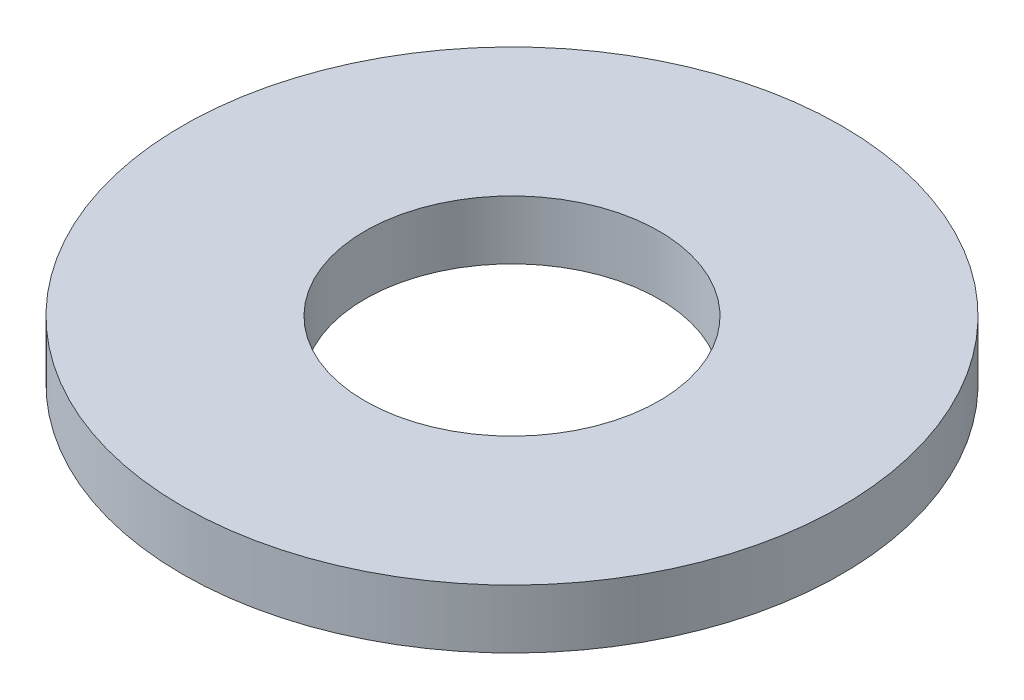
ISO-10303-21;
HEADER;
FILE_DESCRIPTION(('STEP AP214'),'2;1');
FILE_NAME('part.step','',(''),(''),'','','');
FILE_SCHEMA(('AUTOMOTIVE_DESIGN { 1 0 10303 214 1 1 1 1 }'));
ENDSEC;
DATA;
#1=APPLICATION_CONTEXT('core data for automotive mechanical design processes');
#2=APPLICATION_PROTOCOL_DEFINITION('international standard','automotive_design',2000,#1);
#3=PRODUCT_CONTEXT('',#1,'mechanical');
#4=PRODUCT('Part','Part','',(#3));
#5=PRODUCT_RELATED_PRODUCT_CATEGORY('part','',(#4));
#6=PRODUCT_DEFINITION_FORMATION('','',#4);
#7=PRODUCT_DEFINITION_CONTEXT('part definition',#1,'design');
#8=PRODUCT_DEFINITION('design','',#6,#7);
#9=PRODUCT_DEFINITION_SHAPE('','',#8);
#10=(LENGTH_UNIT() NAMED_UNIT(*) SI_UNIT(.MILLI.,.METRE.));
#11=(NAMED_UNIT(*) PLANE_ANGLE_UNIT() SI_UNIT($,.RADIAN.));
#12=(NAMED_UNIT(*) SI_UNIT($,.STERADIAN.) SOLID_ANGLE_UNIT());
#13=UNCERTAINTY_MEASURE_WITH_UNIT(LENGTH_MEASURE(1.E-05),#10,'distance_accuracy_value','');
#14=(GEOMETRIC_REPRESENTATION_CONTEXT(3) GLOBAL_UNCERTAINTY_ASSIGNED_CONTEXT((#13)) GLOBAL_UNIT_ASSIGNED_CONTEXT((#10,
#11,#12)) REPRESENTATION_CONTEXT('',''));
#15=CARTESIAN_POINT('',(0.,0.,0.));
#16=DIRECTION('',(0.,0.,1.));
#17=DIRECTION('',(1.,0.,0.));
#18=AXIS2_PLACEMENT_3D('',#15,#16,#17);
#19=CARTESIAN_POINT('',(0.,3.175,0.));
#20=DIRECTION('',(0.,1.,0.));
#21=DIRECTION('',(0.,0.,1.));
#22=AXIS2_PLACEMENT_3D('',#19,#20,#21);
#23=PLANE('',#22);
#24=CARTESIAN_POINT('',(0.,3.175,0.));
#25=DIRECTION('',(0.,1.,0.));
#26=DIRECTION('',(0.,0.,1.));
#27=AXIS2_PLACEMENT_3D('',#24,#25,#26);
#28=CIRCLE('',#27,17.78);
#29=CARTESIAN_POINT('',(0.,3.175,17.78));
#30=VERTEX_POINT('',#29);
#31=EDGE_CURVE('E10',#30,#30,#28,.T.);
#32=ORIENTED_EDGE('',*,*,#31,.T.);
#33=EDGE_LOOP('',(#32));
#34=FACE_BOUND('',#33,.T.);
#35=CARTESIAN_POINT('',(0.,3.175,0.));
#36=DIRECTION('',(0.,1.,0.));
#37=DIRECTION('',(0.,0.,1.));
#38=AXIS2_PLACEMENT_3D('',#35,#36,#37);
#39=CIRCLE('',#38,7.9375);
#40=CARTESIAN_POINT('',(0.,3.175,7.9375));
#41=VERTEX_POINT('',#40);
#42=EDGE_CURVE('E49',#41,#41,#39,.T.);
#43=ORIENTED_EDGE('',*,*,#42,.F.);
#44=EDGE_LOOP('',(#43));
#45=FACE_BOUND('',#44,.T.);
#46=ADVANCED_FACE('F38',(#34,#45),#23,.T.);
#47=CARTESIAN_POINT('',(0.,0.,0.));
#48=DIRECTION('',(0.,1.,0.));
#49=DIRECTION('',(0.,0.,1.));
#50=AXIS2_PLACEMENT_3D('',#47,#48,#49);
#51=PLANE('',#50);
#52=CARTESIAN_POINT('',(0.,0.,0.));
#53=DIRECTION('',(0.,1.,0.));
#54=DIRECTION('',(0.,0.,1.));
#55=AXIS2_PLACEMENT_3D('',#52,#53,#54);
#56=CIRCLE('',#55,17.78);
#57=CARTESIAN_POINT('',(0.,0.,17.78));
#58=VERTEX_POINT('',#57);
#59=EDGE_CURVE('E42',#58,#58,#56,.T.);
#60=ORIENTED_EDGE('',*,*,#59,.F.);
#61=EDGE_LOOP('',(#60));
#62=FACE_BOUND('',#61,.T.);
#63=CARTESIAN_POINT('',(0.,0.,0.));
#64=DIRECTION('',(0.,1.,0.));
#65=DIRECTION('',(0.,0.,1.));
#66=AXIS2_PLACEMENT_3D('',#63,#64,#65);
#67=CIRCLE('',#66,7.9375);
#68=CARTESIAN_POINT('',(0.,0.,7.9375));
#69=VERTEX_POINT('',#68);
#70=EDGE_CURVE('E51',#69,#69,#67,.T.);
#71=ORIENTED_EDGE('',*,*,#70,.T.);
#72=EDGE_LOOP('',(#71));
#73=FACE_BOUND('',#72,.T.);
#74=ADVANCED_FACE('F61',(#62,#73),#51,.F.);
#75=CARTESIAN_POINT('',(0.,3.175,0.));
#76=DIRECTION('',(0.,-1.,0.));
#77=DIRECTION('',(0.,0.,-1.));
#78=AXIS2_PLACEMENT_3D('',#75,#76,#77);
#79=CYLINDRICAL_SURFACE('',#78,17.78);
#80=ORIENTED_EDGE('',*,*,#31,.F.);
#81=EDGE_LOOP('',(#80));
#82=FACE_BOUND('',#81,.T.);
#83=ORIENTED_EDGE('',*,*,#59,.T.);
#84=EDGE_LOOP('',(#83));
#85=FACE_BOUND('',#84,.T.);
#86=ADVANCED_FACE('F40',(#82,#85),#79,.T.);
#87=CARTESIAN_POINT('',(0.,3.175,0.));
#88=DIRECTION('',(0.,-1.,0.));
#89=DIRECTION('',(0.,0.,-1.));
#90=AXIS2_PLACEMENT_3D('',#87,#88,#89);
#91=CYLINDRICAL_SURFACE('',#90,7.9375);
#92=ORIENTED_EDGE('',*,*,#42,.T.);
#93=EDGE_LOOP('',(#92));
#94=FACE_BOUND('',#93,.T.);
#95=ORIENTED_EDGE('',*,*,#70,.F.);
#96=EDGE_LOOP('',(#95));
#97=FACE_BOUND('',#96,.T.);
#98=ADVANCED_FACE('F57',(#94,#97),#91,.F.);
#99=CLOSED_SHELL('',(#46,#74,#86,#98));
#100=MANIFOLD_SOLID_BREP('B2',#99);
#101=ADVANCED_BREP_SHAPE_REPRESENTATION('',(#18,#100),#14);
#102=SHAPE_DEFINITION_REPRESENTATION(#9,#101);
ENDSEC;
END-ISO-10303-21;
